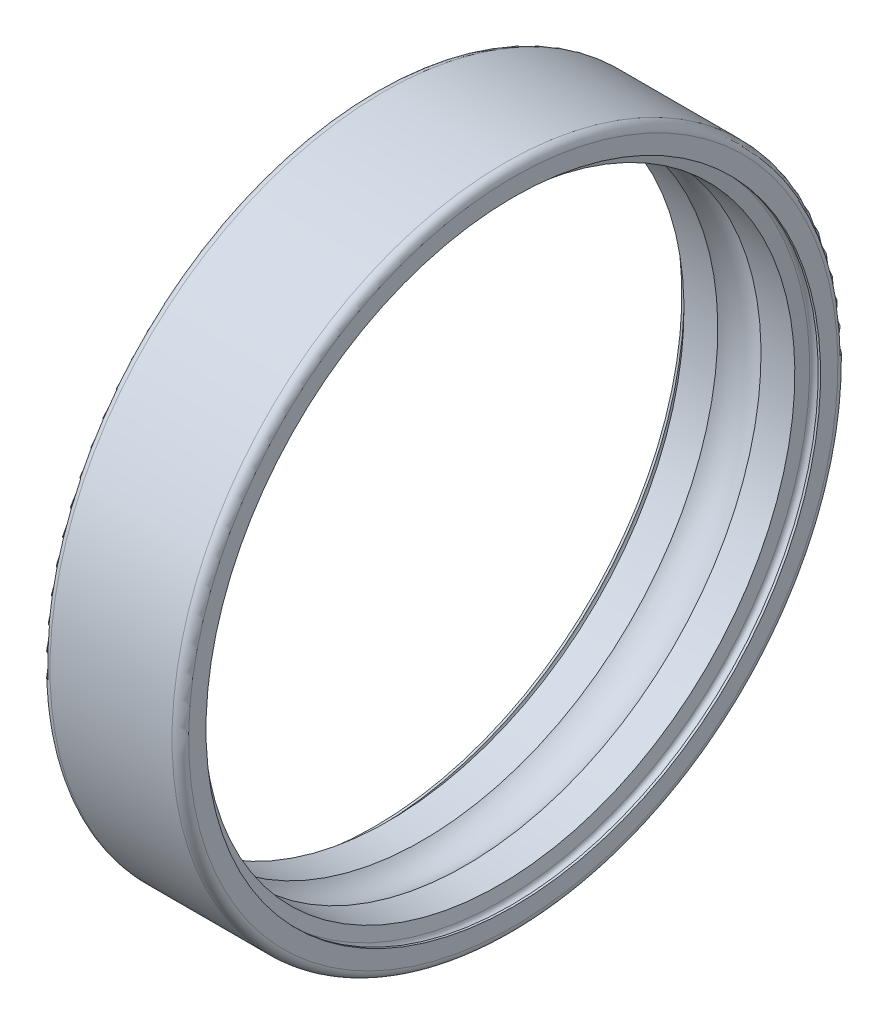
ISO-10303-21;
HEADER;
FILE_DESCRIPTION(('STEP AP214'),'2;1');
FILE_NAME('part.step','',(''),(''),'','','');
FILE_SCHEMA(('AUTOMOTIVE_DESIGN { 1 0 10303 214 1 1 1 1 }'));
ENDSEC;
DATA;
#1=APPLICATION_CONTEXT('core data for automotive mechanical design processes');
#2=APPLICATION_PROTOCOL_DEFINITION('international standard','automotive_design',2000,#1);
#3=PRODUCT_CONTEXT('',#1,'mechanical');
#4=PRODUCT('Part','Part','',(#3));
#5=PRODUCT_RELATED_PRODUCT_CATEGORY('part','',(#4));
#6=PRODUCT_DEFINITION_FORMATION('','',#4);
#7=PRODUCT_DEFINITION_CONTEXT('part definition',#1,'design');
#8=PRODUCT_DEFINITION('design','',#6,#7);
#9=PRODUCT_DEFINITION_SHAPE('','',#8);
#10=(LENGTH_UNIT() NAMED_UNIT(*) SI_UNIT(.MILLI.,.METRE.));
#11=(NAMED_UNIT(*) PLANE_ANGLE_UNIT() SI_UNIT($,.RADIAN.));
#12=(NAMED_UNIT(*) SI_UNIT($,.STERADIAN.) SOLID_ANGLE_UNIT());
#13=UNCERTAINTY_MEASURE_WITH_UNIT(LENGTH_MEASURE(1.E-05),#10,'distance_accuracy_value','');
#14=(GEOMETRIC_REPRESENTATION_CONTEXT(3) GLOBAL_UNCERTAINTY_ASSIGNED_CONTEXT((#13)) GLOBAL_UNIT_ASSIGNED_CONTEXT((#10,
#11,#12)) REPRESENTATION_CONTEXT('',''));
#15=CARTESIAN_POINT('',(0.,0.,0.));
#16=DIRECTION('',(0.,0.,1.));
#17=DIRECTION('',(1.,0.,0.));
#18=AXIS2_PLACEMENT_3D('',#15,#16,#17);
#19=CARTESIAN_POINT('',(4.745,0.,0.));
#20=DIRECTION('',(1.,0.,0.));
#21=DIRECTION('',(0.,0.,-1.));
#22=AXIS2_PLACEMENT_3D('',#19,#20,#21);
#23=TOROIDAL_SURFACE('',#22,11.075,0.17);
#24=CARTESIAN_POINT('',(4.915,0.,0.));
#25=DIRECTION('',(1.,0.,0.));
#26=DIRECTION('',(0.,1.,0.));
#27=AXIS2_PLACEMENT_3D('',#24,#25,#26);
#28=CIRCLE('',#27,11.075);
#29=CARTESIAN_POINT('',(4.915,11.075,0.));
#30=VERTEX_POINT('',#29);
#31=EDGE_CURVE('E10',#30,#30,#28,.T.);
#32=ORIENTED_EDGE('',*,*,#31,.T.);
#33=EDGE_LOOP('',(#32));
#34=FACE_BOUND('',#33,.T.);
#35=CARTESIAN_POINT('',(4.57758268198793,0.,0.));
#36=DIRECTION('',(1.,0.,0.));
#37=DIRECTION('',(0.,1.,0.));
#38=AXIS2_PLACEMENT_3D('',#35,#36,#37);
#39=CIRCLE('',#38,11.1045201902034);
#40=CARTESIAN_POINT('',(4.57758268198793,11.1045201902034,0.));
#41=VERTEX_POINT('',#40);
#42=EDGE_CURVE('E86',#41,#41,#39,.T.);
#43=ORIENTED_EDGE('',*,*,#42,.F.);
#44=EDGE_LOOP('',(#43));
#45=FACE_BOUND('',#44,.T.);
#46=ADVANCED_FACE('F15',(#34,#45),#23,.F.);
#47=CARTESIAN_POINT('',(4.9575,0.,0.));
#48=DIRECTION('',(-1.,0.,0.));
#49=DIRECTION('',(0.,1.,0.));
#50=AXIS2_PLACEMENT_3D('',#47,#48,#49);
#51=CYLINDRICAL_SURFACE('',#50,11.075);
#52=CARTESIAN_POINT('',(5.,0.,0.));
#53=DIRECTION('',(1.,0.,0.));
#54=DIRECTION('',(0.,1.,0.));
#55=AXIS2_PLACEMENT_3D('',#52,#53,#54);
#56=CIRCLE('',#55,11.075);
#57=CARTESIAN_POINT('',(5.,11.075,0.));
#58=VERTEX_POINT('',#57);
#59=EDGE_CURVE('E25',#58,#58,#56,.T.);
#60=ORIENTED_EDGE('',*,*,#59,.T.);
#61=EDGE_LOOP('',(#60));
#62=FACE_BOUND('',#61,.T.);
#63=ORIENTED_EDGE('',*,*,#31,.F.);
#64=EDGE_LOOP('',(#63));
#65=FACE_BOUND('',#64,.T.);
#66=ADVANCED_FACE('F107',(#62,#65),#51,.F.);
#67=CARTESIAN_POINT('',(5.,11.3875,0.));
#68=DIRECTION('',(1.,0.,0.));
#69=DIRECTION('',(0.,1.,0.));
#70=AXIS2_PLACEMENT_3D('',#67,#68,#69);
#71=PLANE('',#70);
#72=CARTESIAN_POINT('',(5.,0.,0.));
#73=DIRECTION('',(1.,0.,0.));
#74=DIRECTION('',(0.,1.,0.));
#75=AXIS2_PLACEMENT_3D('',#72,#73,#74);
#76=CIRCLE('',#75,11.7);
#77=CARTESIAN_POINT('',(5.,11.7,0.));
#78=VERTEX_POINT('',#77);
#79=EDGE_CURVE('E81',#78,#78,#76,.T.);
#80=ORIENTED_EDGE('',*,*,#79,.T.);
#81=EDGE_LOOP('',(#80));
#82=FACE_BOUND('',#81,.T.);
#83=ORIENTED_EDGE('',*,*,#59,.F.);
#84=EDGE_LOOP('',(#83));
#85=FACE_BOUND('',#84,.T.);
#86=ADVANCED_FACE('F17',(#82,#85),#71,.T.);
#87=CARTESIAN_POINT('',(4.7,0.,0.));
#88=DIRECTION('',(1.,0.,0.));
#89=DIRECTION('',(0.,0.,-1.));
#90=AXIS2_PLACEMENT_3D('',#87,#88,#89);
#91=TOROIDAL_SURFACE('',#90,11.7,0.3);
#92=CARTESIAN_POINT('',(4.7,0.,0.));
#93=DIRECTION('',(1.,0.,0.));
#94=DIRECTION('',(0.,1.,0.));
#95=AXIS2_PLACEMENT_3D('',#92,#93,#94);
#96=CIRCLE('',#95,12.);
#97=CARTESIAN_POINT('',(4.7,12.,0.));
#98=VERTEX_POINT('',#97);
#99=EDGE_CURVE('E78',#98,#98,#96,.T.);
#100=ORIENTED_EDGE('',*,*,#99,.T.);
#101=EDGE_LOOP('',(#100));
#102=FACE_BOUND('',#101,.T.);
#103=ORIENTED_EDGE('',*,*,#79,.F.);
#104=EDGE_LOOP('',(#103));
#105=FACE_BOUND('',#104,.T.);
#106=ADVANCED_FACE('F118',(#102,#105),#91,.T.);
#107=CARTESIAN_POINT('',(2.5,0.,0.));
#108=DIRECTION('',(-1.,0.,0.));
#109=DIRECTION('',(0.,1.,0.));
#110=AXIS2_PLACEMENT_3D('',#107,#108,#109);
#111=CYLINDRICAL_SURFACE('',#110,12.);
#112=CARTESIAN_POINT('',(0.3,0.,0.));
#113=DIRECTION('',(1.,0.,0.));
#114=DIRECTION('',(0.,1.,0.));
#115=AXIS2_PLACEMENT_3D('',#112,#113,#114);
#116=CIRCLE('',#115,12.);
#117=CARTESIAN_POINT('',(0.3,12.,0.));
#118=VERTEX_POINT('',#117);
#119=EDGE_CURVE('E82',#118,#118,#116,.T.);
#120=ORIENTED_EDGE('',*,*,#119,.T.);
#121=EDGE_LOOP('',(#120));
#122=FACE_BOUND('',#121,.T.);
#123=ORIENTED_EDGE('',*,*,#99,.F.);
#124=EDGE_LOOP('',(#123));
#125=FACE_BOUND('',#124,.T.);
#126=ADVANCED_FACE('F121',(#122,#125),#111,.T.);
#127=CARTESIAN_POINT('',(0.3,0.,0.));
#128=DIRECTION('',(1.,0.,0.));
#129=DIRECTION('',(0.,0.,-1.));
#130=AXIS2_PLACEMENT_3D('',#127,#128,#129);
#131=TOROIDAL_SURFACE('',#130,11.7,0.3);
#132=CARTESIAN_POINT('',(0.,0.,0.));
#133=DIRECTION('',(1.,0.,0.));
#134=DIRECTION('',(0.,1.,0.));
#135=AXIS2_PLACEMENT_3D('',#132,#133,#134);
#136=CIRCLE('',#135,11.7);
#137=CARTESIAN_POINT('',(0.,11.7,0.));
#138=VERTEX_POINT('',#137);
#139=EDGE_CURVE('E46',#138,#138,#136,.T.);
#140=ORIENTED_EDGE('',*,*,#139,.T.);
#141=EDGE_LOOP('',(#140));
#142=FACE_BOUND('',#141,.T.);
#143=ORIENTED_EDGE('',*,*,#119,.F.);
#144=EDGE_LOOP('',(#143));
#145=FACE_BOUND('',#144,.T.);
#146=ADVANCED_FACE('F117',(#142,#145),#131,.T.);
#147=CARTESIAN_POINT('',(0.,11.3875,0.));
#148=DIRECTION('',(-1.,0.,0.));
#149=DIRECTION('',(0.,-1.,0.));
#150=AXIS2_PLACEMENT_3D('',#147,#148,#149);
#151=PLANE('',#150);
#152=CARTESIAN_POINT('',(0.,0.,0.));
#153=DIRECTION('',(1.,0.,0.));
#154=DIRECTION('',(0.,1.,0.));
#155=AXIS2_PLACEMENT_3D('',#152,#153,#154);
#156=CIRCLE('',#155,11.075);
#157=CARTESIAN_POINT('',(0.,11.075,0.));
#158=VERTEX_POINT('',#157);
#159=EDGE_CURVE('E53',#158,#158,#156,.T.);
#160=ORIENTED_EDGE('',*,*,#159,.T.);
#161=EDGE_LOOP('',(#160));
#162=FACE_BOUND('',#161,.T.);
#163=ORIENTED_EDGE('',*,*,#139,.F.);
#164=EDGE_LOOP('',(#163));
#165=FACE_BOUND('',#164,.T.);
#166=ADVANCED_FACE('F103',(#162,#165),#151,.T.);
#167=CARTESIAN_POINT('',(0.0424999999999996,0.,0.));
#168=DIRECTION('',(-1.,0.,0.));
#169=DIRECTION('',(0.,1.,0.));
#170=AXIS2_PLACEMENT_3D('',#167,#168,#169);
#171=CYLINDRICAL_SURFACE('',#170,11.075);
#172=CARTESIAN_POINT('',(0.0849999999999991,0.,0.));
#173=DIRECTION('',(1.,0.,0.));
#174=DIRECTION('',(0.,1.,0.));
#175=AXIS2_PLACEMENT_3D('',#172,#173,#174);
#176=CIRCLE('',#175,11.075);
#177=CARTESIAN_POINT('',(0.085,11.075,0.));
#178=VERTEX_POINT('',#177);
#179=EDGE_CURVE('E72',#178,#178,#176,.T.);
#180=ORIENTED_EDGE('',*,*,#179,.T.);
#181=EDGE_LOOP('',(#180));
#182=FACE_BOUND('',#181,.T.);
#183=ORIENTED_EDGE('',*,*,#159,.F.);
#184=EDGE_LOOP('',(#183));
#185=FACE_BOUND('',#184,.T.);
#186=ADVANCED_FACE('F89',(#182,#185),#171,.F.);
#187=CARTESIAN_POINT('',(0.255,0.,0.));
#188=DIRECTION('',(1.,0.,0.));
#189=DIRECTION('',(0.,0.,-1.));
#190=AXIS2_PLACEMENT_3D('',#187,#188,#189);
#191=TOROIDAL_SURFACE('',#190,11.075,0.17);
#192=CARTESIAN_POINT('',(0.422417318012074,0.,0.));
#193=DIRECTION('',(1.,0.,0.));
#194=DIRECTION('',(0.,1.,0.));
#195=AXIS2_PLACEMENT_3D('',#192,#193,#194);
#196=CIRCLE('',#195,11.1045201902034);
#197=CARTESIAN_POINT('',(0.422417318012074,11.1045201902034,0.));
#198=VERTEX_POINT('',#197);
#199=EDGE_CURVE('E19',#198,#198,#196,.T.);
#200=ORIENTED_EDGE('',*,*,#199,.T.);
#201=EDGE_LOOP('',(#200));
#202=FACE_BOUND('',#201,.T.);
#203=ORIENTED_EDGE('',*,*,#179,.F.);
#204=EDGE_LOOP('',(#203));
#205=FACE_BOUND('',#204,.T.);
#206=ADVANCED_FACE('F92',(#202,#205),#191,.F.);
#207=CARTESIAN_POINT('',(0.462489404416873,0.,0.));
#208=DIRECTION('',(-1.,0.,0.));
#209=DIRECTION('',(0.,1.,0.));
#210=AXIS2_PLACEMENT_3D('',#207,#208,#209);
#211=CONICAL_SURFACE('',#210,10.8772600951017,1.39626340159546);
#212=CARTESIAN_POINT('',(0.502561490821673,0.,0.));
#213=DIRECTION('',(1.,0.,0.));
#214=DIRECTION('',(0.,1.,0.));
#215=AXIS2_PLACEMENT_3D('',#212,#213,#214);
#216=CIRCLE('',#215,10.65);
#217=CARTESIAN_POINT('',(0.502561490821673,10.65,0.));
#218=VERTEX_POINT('',#217);
#219=EDGE_CURVE('E66',#218,#218,#216,.T.);
#220=ORIENTED_EDGE('',*,*,#219,.T.);
#221=EDGE_LOOP('',(#220));
#222=FACE_BOUND('',#221,.T.);
#223=ORIENTED_EDGE('',*,*,#199,.F.);
#224=EDGE_LOOP('',(#223));
#225=FACE_BOUND('',#224,.T.);
#226=ADVANCED_FACE('F67',(#222,#225),#211,.F.);
#227=CARTESIAN_POINT('',(1.11163659685988,0.,0.));
#228=DIRECTION('',(-1.,0.,0.));
#229=DIRECTION('',(0.,1.,0.));
#230=AXIS2_PLACEMENT_3D('',#227,#228,#229);
#231=CYLINDRICAL_SURFACE('',#230,10.65);
#232=CARTESIAN_POINT('',(1.72071170289809,0.,0.));
#233=DIRECTION('',(1.,0.,0.));
#234=DIRECTION('',(0.,1.,0.));
#235=AXIS2_PLACEMENT_3D('',#232,#233,#234);
#236=CIRCLE('',#235,10.65);
#237=CARTESIAN_POINT('',(1.72071170289809,10.65,0.));
#238=VERTEX_POINT('',#237);
#239=EDGE_CURVE('E70',#238,#238,#236,.T.);
#240=ORIENTED_EDGE('',*,*,#239,.T.);
#241=EDGE_LOOP('',(#240));
#242=FACE_BOUND('',#241,.T.);
#243=ORIENTED_EDGE('',*,*,#219,.F.);
#244=EDGE_LOOP('',(#243));
#245=FACE_BOUND('',#244,.T.);
#246=ADVANCED_FACE('F101',(#242,#245),#231,.F.);
#247=CARTESIAN_POINT('',(2.5,0.,0.));
#248=DIRECTION('',(1.,0.,0.));
#249=DIRECTION('',(0.,0.,-1.));
#250=AXIS2_PLACEMENT_3D('',#247,#248,#249);
#251=TOROIDAL_SURFACE('',#250,9.75,1.1905);
#252=CARTESIAN_POINT('',(3.27928829710191,0.,0.));
#253=DIRECTION('',(1.,0.,0.));
#254=DIRECTION('',(0.,1.,0.));
#255=AXIS2_PLACEMENT_3D('',#252,#253,#254);
#256=CIRCLE('',#255,10.65);
#257=CARTESIAN_POINT('',(3.27928829710191,10.65,0.));
#258=VERTEX_POINT('',#257);
#259=EDGE_CURVE('E73',#258,#258,#256,.T.);
#260=ORIENTED_EDGE('',*,*,#259,.T.);
#261=EDGE_LOOP('',(#260));
#262=FACE_BOUND('',#261,.T.);
#263=ORIENTED_EDGE('',*,*,#239,.F.);
#264=EDGE_LOOP('',(#263));
#265=FACE_BOUND('',#264,.T.);
#266=ADVANCED_FACE('F131',(#262,#265),#251,.F.);
#267=CARTESIAN_POINT('',(3.88836340314012,0.,0.));
#268=DIRECTION('',(-1.,0.,0.));
#269=DIRECTION('',(0.,1.,0.));
#270=AXIS2_PLACEMENT_3D('',#267,#268,#269);
#271=CYLINDRICAL_SURFACE('',#270,10.65);
#272=CARTESIAN_POINT('',(4.49743850917833,0.,0.));
#273=DIRECTION('',(1.,0.,0.));
#274=DIRECTION('',(0.,1.,0.));
#275=AXIS2_PLACEMENT_3D('',#272,#273,#274);
#276=CIRCLE('',#275,10.65);
#277=CARTESIAN_POINT('',(4.49743850917833,10.65,0.));
#278=VERTEX_POINT('',#277);
#279=EDGE_CURVE('E155',#278,#278,#276,.T.);
#280=ORIENTED_EDGE('',*,*,#279,.T.);
#281=EDGE_LOOP('',(#280));
#282=FACE_BOUND('',#281,.T.);
#283=ORIENTED_EDGE('',*,*,#259,.F.);
#284=EDGE_LOOP('',(#283));
#285=FACE_BOUND('',#284,.T.);
#286=ADVANCED_FACE('F128',(#282,#285),#271,.F.);
#287=CARTESIAN_POINT('',(4.53751059558313,0.,0.));
#288=DIRECTION('',(1.,0.,0.));
#289=DIRECTION('',(0.,1.,0.));
#290=AXIS2_PLACEMENT_3D('',#287,#288,#289);
#291=CONICAL_SURFACE('',#290,10.8772600951017,1.39626340159547);
#292=ORIENTED_EDGE('',*,*,#42,.T.);
#293=EDGE_LOOP('',(#292));
#294=FACE_BOUND('',#293,.T.);
#295=ORIENTED_EDGE('',*,*,#279,.F.);
#296=EDGE_LOOP('',(#295));
#297=FACE_BOUND('',#296,.T.);
#298=ADVANCED_FACE('F126',(#294,#297),#291,.F.);
#299=CLOSED_SHELL('',(#46,#66,#86,#106,#126,#146,#166,#186,#206,#226,#246,#266,#286,#298));
#300=MANIFOLD_SOLID_BREP('B1',#299);
#301=ADVANCED_BREP_SHAPE_REPRESENTATION('',(#18,#300),#14);
#302=SHAPE_DEFINITION_REPRESENTATION(#9,#301);
ENDSEC;
END-ISO-10303-21;
